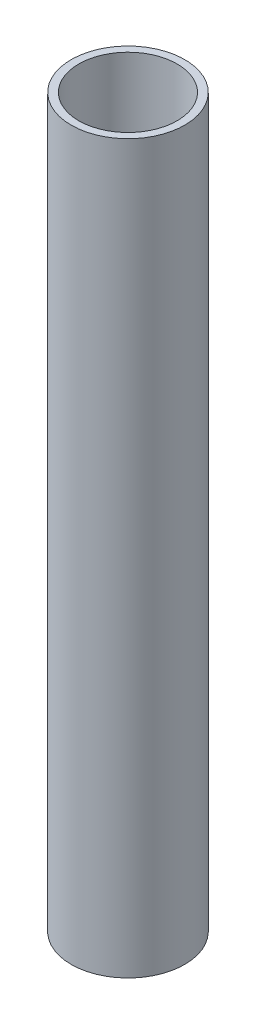
ISO-10303-21;
HEADER;
FILE_DESCRIPTION(('STEP AP214'),'2;1');
FILE_NAME('part.step','',(''),(''),'','','');
FILE_SCHEMA(('AUTOMOTIVE_DESIGN { 1 0 10303 214 1 1 1 1 }'));
ENDSEC;
DATA;
#1=APPLICATION_CONTEXT('core data for automotive mechanical design processes');
#2=APPLICATION_PROTOCOL_DEFINITION('international standard','automotive_design',2000,#1);
#3=PRODUCT_CONTEXT('',#1,'mechanical');
#4=PRODUCT('Part','Part','',(#3));
#5=PRODUCT_RELATED_PRODUCT_CATEGORY('part','',(#4));
#6=PRODUCT_DEFINITION_FORMATION('','',#4);
#7=PRODUCT_DEFINITION_CONTEXT('part definition',#1,'design');
#8=PRODUCT_DEFINITION('design','',#6,#7);
#9=PRODUCT_DEFINITION_SHAPE('','',#8);
#10=(LENGTH_UNIT() NAMED_UNIT(*) SI_UNIT(.MILLI.,.METRE.));
#11=(NAMED_UNIT(*) PLANE_ANGLE_UNIT() SI_UNIT($,.RADIAN.));
#12=(NAMED_UNIT(*) SI_UNIT($,.STERADIAN.) SOLID_ANGLE_UNIT());
#13=UNCERTAINTY_MEASURE_WITH_UNIT(LENGTH_MEASURE(1.E-05),#10,'distance_accuracy_value','');
#14=(GEOMETRIC_REPRESENTATION_CONTEXT(3) GLOBAL_UNCERTAINTY_ASSIGNED_CONTEXT((#13)) GLOBAL_UNIT_ASSIGNED_CONTEXT((#10,
#11,#12)) REPRESENTATION_CONTEXT('',''));
#15=CARTESIAN_POINT('',(0.,0.,0.));
#16=DIRECTION('',(0.,0.,1.));
#17=DIRECTION('',(1.,0.,0.));
#18=AXIS2_PLACEMENT_3D('',#15,#16,#17);
#19=CARTESIAN_POINT('',(0.,96.,0.));
#20=DIRECTION('',(0.,1.,0.));
#21=DIRECTION('',(0.,0.,1.));
#22=AXIS2_PLACEMENT_3D('',#19,#20,#21);
#23=PLANE('',#22);
#24=CARTESIAN_POINT('',(0.,96.,0.));
#25=DIRECTION('',(0.,1.,0.));
#26=DIRECTION('',(0.,0.,1.));
#27=AXIS2_PLACEMENT_3D('',#24,#25,#26);
#28=CIRCLE('',#27,7.5);
#29=CARTESIAN_POINT('',(0.,96.,7.5));
#30=VERTEX_POINT('',#29);
#31=EDGE_CURVE('E10',#30,#30,#28,.T.);
#32=ORIENTED_EDGE('',*,*,#31,.T.);
#33=EDGE_LOOP('',(#32));
#34=FACE_BOUND('',#33,.T.);
#35=CARTESIAN_POINT('',(0.,96.,0.));
#36=DIRECTION('',(0.,1.,0.));
#37=DIRECTION('',(0.,0.,1.));
#38=AXIS2_PLACEMENT_3D('',#35,#36,#37);
#39=CIRCLE('',#38,6.5);
#40=CARTESIAN_POINT('',(0.,96.,6.5));
#41=VERTEX_POINT('',#40);
#42=EDGE_CURVE('E54',#41,#41,#39,.T.);
#43=ORIENTED_EDGE('',*,*,#42,.F.);
#44=EDGE_LOOP('',(#43));
#45=FACE_BOUND('',#44,.T.);
#46=ADVANCED_FACE('F41',(#34,#45),#23,.T.);
#47=CARTESIAN_POINT('',(0.,0.,0.));
#48=DIRECTION('',(0.,1.,0.));
#49=DIRECTION('',(0.,0.,1.));
#50=AXIS2_PLACEMENT_3D('',#47,#48,#49);
#51=PLANE('',#50);
#52=CARTESIAN_POINT('',(0.,0.,0.));
#53=DIRECTION('',(0.,1.,0.));
#54=DIRECTION('',(0.,0.,1.));
#55=AXIS2_PLACEMENT_3D('',#52,#53,#54);
#56=CIRCLE('',#55,7.5);
#57=CARTESIAN_POINT('',(0.,0.,7.5));
#58=VERTEX_POINT('',#57);
#59=EDGE_CURVE('E45',#58,#58,#56,.T.);
#60=ORIENTED_EDGE('',*,*,#59,.F.);
#61=EDGE_LOOP('',(#60));
#62=FACE_BOUND('',#61,.T.);
#63=CARTESIAN_POINT('',(0.,0.,0.));
#64=DIRECTION('',(0.,1.,0.));
#65=DIRECTION('',(0.,0.,1.));
#66=AXIS2_PLACEMENT_3D('',#63,#64,#65);
#67=CIRCLE('',#66,6.5);
#68=CARTESIAN_POINT('',(0.,0.,6.5));
#69=VERTEX_POINT('',#68);
#70=EDGE_CURVE('E56',#69,#69,#67,.T.);
#71=ORIENTED_EDGE('',*,*,#70,.T.);
#72=EDGE_LOOP('',(#71));
#73=FACE_BOUND('',#72,.T.);
#74=ADVANCED_FACE('F68',(#62,#73),#51,.F.);
#75=CARTESIAN_POINT('',(0.,96.,0.));
#76=DIRECTION('',(0.,-1.,0.));
#77=DIRECTION('',(0.,0.,-1.));
#78=AXIS2_PLACEMENT_3D('',#75,#76,#77);
#79=CYLINDRICAL_SURFACE('',#78,7.5);
#80=ORIENTED_EDGE('',*,*,#31,.F.);
#81=EDGE_LOOP('',(#80));
#82=FACE_BOUND('',#81,.T.);
#83=ORIENTED_EDGE('',*,*,#59,.T.);
#84=EDGE_LOOP('',(#83));
#85=FACE_BOUND('',#84,.T.);
#86=ADVANCED_FACE('F43',(#82,#85),#79,.T.);
#87=CARTESIAN_POINT('',(0.,96.,0.));
#88=DIRECTION('',(0.,-1.,0.));
#89=DIRECTION('',(0.,0.,-1.));
#90=AXIS2_PLACEMENT_3D('',#87,#88,#89);
#91=CYLINDRICAL_SURFACE('',#90,6.5);
#92=ORIENTED_EDGE('',*,*,#42,.T.);
#93=EDGE_LOOP('',(#92));
#94=FACE_BOUND('',#93,.T.);
#95=ORIENTED_EDGE('',*,*,#70,.F.);
#96=EDGE_LOOP('',(#95));
#97=FACE_BOUND('',#96,.T.);
#98=ADVANCED_FACE('F64',(#94,#97),#91,.F.);
#99=CLOSED_SHELL('',(#46,#74,#86,#98));
#100=MANIFOLD_SOLID_BREP('B2',#99);
#101=ADVANCED_BREP_SHAPE_REPRESENTATION('',(#18,#100),#14);
#102=SHAPE_DEFINITION_REPRESENTATION(#9,#101);
ENDSEC;
END-ISO-10303-21;
